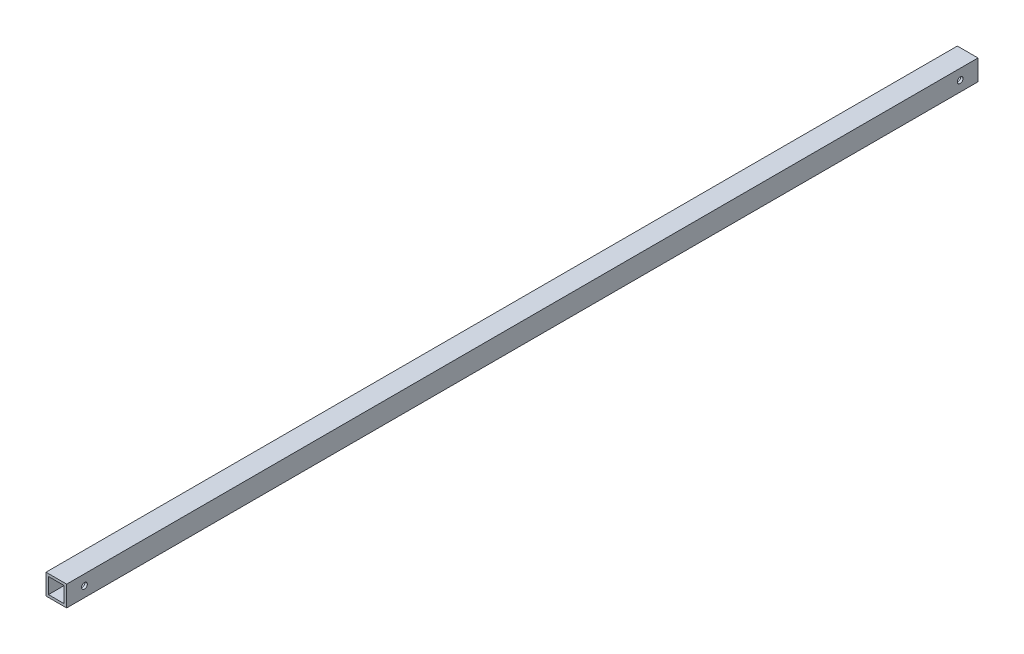
ISO-10303-21;
HEADER;
FILE_DESCRIPTION(('STEP AP214'),'2;1');
FILE_NAME('part.step','',(''),(''),'','','');
FILE_SCHEMA(('AUTOMOTIVE_DESIGN { 1 0 10303 214 1 1 1 1 }'));
ENDSEC;
DATA;
#1=APPLICATION_CONTEXT('core data for automotive mechanical design processes');
#2=APPLICATION_PROTOCOL_DEFINITION('international standard','automotive_design',2000,#1);
#3=PRODUCT_CONTEXT('',#1,'mechanical');
#4=PRODUCT('Part','Part','',(#3));
#5=PRODUCT_RELATED_PRODUCT_CATEGORY('part','',(#4));
#6=PRODUCT_DEFINITION_FORMATION('','',#4);
#7=PRODUCT_DEFINITION_CONTEXT('part definition',#1,'design');
#8=PRODUCT_DEFINITION('design','',#6,#7);
#9=PRODUCT_DEFINITION_SHAPE('','',#8);
#10=(LENGTH_UNIT() NAMED_UNIT(*) SI_UNIT(.MILLI.,.METRE.));
#11=(NAMED_UNIT(*) PLANE_ANGLE_UNIT() SI_UNIT($,.RADIAN.));
#12=(NAMED_UNIT(*) SI_UNIT($,.STERADIAN.) SOLID_ANGLE_UNIT());
#13=UNCERTAINTY_MEASURE_WITH_UNIT(LENGTH_MEASURE(1.E-05),#10,'distance_accuracy_value','');
#14=(GEOMETRIC_REPRESENTATION_CONTEXT(3) GLOBAL_UNCERTAINTY_ASSIGNED_CONTEXT((#13)) GLOBAL_UNIT_ASSIGNED_CONTEXT((#10,
#11,#12)) REPRESENTATION_CONTEXT('',''));
#15=CARTESIAN_POINT('',(0.,0.,0.));
#16=DIRECTION('',(0.,0.,1.));
#17=DIRECTION('',(1.,0.,0.));
#18=AXIS2_PLACEMENT_3D('',#15,#16,#17);
#19=CARTESIAN_POINT('',(0.,-25.,1102.75));
#20=DIRECTION('',(0.,0.,1.));
#21=DIRECTION('',(1.,0.,0.));
#22=AXIS2_PLACEMENT_3D('',#19,#20,#21);
#23=PLANE('',#22);
#24=DIRECTION('',(0.,-1.,0.));
#25=VECTOR('',#24,1.);
#26=CARTESIAN_POINT('',(0.,0.,1102.75));
#27=LINE('',#26,#25);
#28=CARTESIAN_POINT('',(0.,0.,1102.75));
#29=VERTEX_POINT('',#28);
#30=CARTESIAN_POINT('',(0.,-25.,1102.75));
#31=VERTEX_POINT('',#30);
#32=EDGE_CURVE('E139',#29,#31,#27,.T.);
#33=ORIENTED_EDGE('',*,*,#32,.T.);
#34=DIRECTION('',(1.,0.,0.));
#35=VECTOR('',#34,1.);
#36=CARTESIAN_POINT('',(0.,-25.,1102.75));
#37=LINE('',#36,#35);
#38=CARTESIAN_POINT('',(25.,-25.,1102.75));
#39=VERTEX_POINT('',#38);
#40=EDGE_CURVE('E142',#31,#39,#37,.T.);
#41=ORIENTED_EDGE('',*,*,#40,.T.);
#42=DIRECTION('',(0.,1.,0.));
#43=VECTOR('',#42,1.);
#44=CARTESIAN_POINT('',(25.,0.,1102.75));
#45=LINE('',#44,#43);
#46=CARTESIAN_POINT('',(25.,0.,1102.75));
#47=VERTEX_POINT('',#46);
#48=EDGE_CURVE('E145',#39,#47,#45,.T.);
#49=ORIENTED_EDGE('',*,*,#48,.T.);
#50=DIRECTION('',(-1.,0.,0.));
#51=VECTOR('',#50,1.);
#52=CARTESIAN_POINT('',(0.,0.,1102.75));
#53=LINE('',#52,#51);
#54=EDGE_CURVE('E147',#47,#29,#53,.T.);
#55=ORIENTED_EDGE('',*,*,#54,.T.);
#56=EDGE_LOOP('',(#33,#41,#49,#55));
#57=FACE_BOUND('',#56,.T.);
#58=DIRECTION('',(1.,0.,0.));
#59=VECTOR('',#58,1.);
#60=CARTESIAN_POINT('',(3.,-22.,1102.75));
#61=LINE('',#60,#59);
#62=CARTESIAN_POINT('',(3.,-22.,1102.75));
#63=VERTEX_POINT('',#62);
#64=CARTESIAN_POINT('',(22.,-22.,1102.75));
#65=VERTEX_POINT('',#64);
#66=EDGE_CURVE('E109',#63,#65,#61,.T.);
#67=ORIENTED_EDGE('',*,*,#66,.F.);
#68=DIRECTION('',(0.,-1.,0.));
#69=VECTOR('',#68,1.);
#70=CARTESIAN_POINT('',(3.,-3.,1102.75));
#71=LINE('',#70,#69);
#72=CARTESIAN_POINT('',(3.,-3.,1102.75));
#73=VERTEX_POINT('',#72);
#74=EDGE_CURVE('E101',#73,#63,#71,.T.);
#75=ORIENTED_EDGE('',*,*,#74,.F.);
#76=DIRECTION('',(-1.,0.,0.));
#77=VECTOR('',#76,1.);
#78=CARTESIAN_POINT('',(3.,-3.,1102.75));
#79=LINE('',#78,#77);
#80=CARTESIAN_POINT('',(22.,-3.,1102.75));
#81=VERTEX_POINT('',#80);
#82=EDGE_CURVE('E123',#81,#73,#79,.T.);
#83=ORIENTED_EDGE('',*,*,#82,.F.);
#84=DIRECTION('',(0.,1.,0.));
#85=VECTOR('',#84,1.);
#86=CARTESIAN_POINT('',(22.,-3.,1102.75));
#87=LINE('',#86,#85);
#88=EDGE_CURVE('E121',#65,#81,#87,.T.);
#89=ORIENTED_EDGE('',*,*,#88,.F.);
#90=EDGE_LOOP('',(#67,#75,#83,#89));
#91=FACE_BOUND('',#90,.T.);
#92=ADVANCED_FACE('F35',(#57,#91),#23,.T.);
#93=CARTESIAN_POINT('',(0.,-25.,0.));
#94=DIRECTION('',(0.,0.,1.));
#95=DIRECTION('',(1.,0.,0.));
#96=AXIS2_PLACEMENT_3D('',#93,#94,#95);
#97=PLANE('',#96);
#98=DIRECTION('',(0.,-1.,0.));
#99=VECTOR('',#98,1.);
#100=CARTESIAN_POINT('',(0.,0.,0.));
#101=LINE('',#100,#99);
#102=CARTESIAN_POINT('',(0.,0.,0.));
#103=VERTEX_POINT('',#102);
#104=CARTESIAN_POINT('',(0.,-25.,0.));
#105=VERTEX_POINT('',#104);
#106=EDGE_CURVE('E117',#103,#105,#101,.T.);
#107=ORIENTED_EDGE('',*,*,#106,.F.);
#108=DIRECTION('',(-1.,0.,0.));
#109=VECTOR('',#108,1.);
#110=CARTESIAN_POINT('',(0.,0.,0.));
#111=LINE('',#110,#109);
#112=CARTESIAN_POINT('',(25.,0.,0.));
#113=VERTEX_POINT('',#112);
#114=EDGE_CURVE('E143',#113,#103,#111,.T.);
#115=ORIENTED_EDGE('',*,*,#114,.F.);
#116=DIRECTION('',(0.,1.,0.));
#117=VECTOR('',#116,1.);
#118=CARTESIAN_POINT('',(25.,0.,0.));
#119=LINE('',#118,#117);
#120=CARTESIAN_POINT('',(25.,-25.,0.));
#121=VERTEX_POINT('',#120);
#122=EDGE_CURVE('E154',#121,#113,#119,.T.);
#123=ORIENTED_EDGE('',*,*,#122,.F.);
#124=DIRECTION('',(1.,0.,0.));
#125=VECTOR('',#124,1.);
#126=CARTESIAN_POINT('',(0.,-25.,0.));
#127=LINE('',#126,#125);
#128=EDGE_CURVE('E152',#105,#121,#127,.T.);
#129=ORIENTED_EDGE('',*,*,#128,.F.);
#130=EDGE_LOOP('',(#107,#115,#123,#129));
#131=FACE_BOUND('',#130,.T.);
#132=DIRECTION('',(0.,-1.,0.));
#133=VECTOR('',#132,1.);
#134=CARTESIAN_POINT('',(3.,-3.,0.));
#135=LINE('',#134,#133);
#136=CARTESIAN_POINT('',(3.,-3.,0.));
#137=VERTEX_POINT('',#136);
#138=CARTESIAN_POINT('',(3.,-22.,0.));
#139=VERTEX_POINT('',#138);
#140=EDGE_CURVE('E59',#137,#139,#135,.T.);
#141=ORIENTED_EDGE('',*,*,#140,.T.);
#142=DIRECTION('',(1.,0.,0.));
#143=VECTOR('',#142,1.);
#144=CARTESIAN_POINT('',(3.,-22.,0.));
#145=LINE('',#144,#143);
#146=CARTESIAN_POINT('',(22.,-22.,0.));
#147=VERTEX_POINT('',#146);
#148=EDGE_CURVE('E116',#139,#147,#145,.T.);
#149=ORIENTED_EDGE('',*,*,#148,.T.);
#150=DIRECTION('',(0.,1.,0.));
#151=VECTOR('',#150,1.);
#152=CARTESIAN_POINT('',(22.,-3.,0.));
#153=LINE('',#152,#151);
#154=CARTESIAN_POINT('',(22.,-3.,0.));
#155=VERTEX_POINT('',#154);
#156=EDGE_CURVE('E131',#147,#155,#153,.T.);
#157=ORIENTED_EDGE('',*,*,#156,.T.);
#158=DIRECTION('',(-1.,0.,0.));
#159=VECTOR('',#158,1.);
#160=CARTESIAN_POINT('',(3.,-3.,0.));
#161=LINE('',#160,#159);
#162=EDGE_CURVE('E110',#155,#137,#161,.T.);
#163=ORIENTED_EDGE('',*,*,#162,.T.);
#164=EDGE_LOOP('',(#141,#149,#157,#163));
#165=FACE_BOUND('',#164,.T.);
#166=ADVANCED_FACE('F173',(#131,#165),#97,.F.);
#167=CARTESIAN_POINT('',(0.,0.,1102.75));
#168=DIRECTION('',(1.,0.,0.));
#169=DIRECTION('',(0.,1.,0.));
#170=AXIS2_PLACEMENT_3D('',#167,#168,#169);
#171=PLANE('',#170);
#172=CARTESIAN_POINT('',(0.,-12.5,21.5599999999998));
#173=DIRECTION('',(-1.,0.,0.));
#174=DIRECTION('',(0.,0.,1.));
#175=AXIS2_PLACEMENT_3D('',#172,#173,#174);
#176=CIRCLE('',#175,3.5);
#177=CARTESIAN_POINT('',(0.,-12.5,25.0599999999998));
#178=VERTEX_POINT('',#177);
#179=EDGE_CURVE('E225',#178,#178,#176,.T.);
#180=ORIENTED_EDGE('',*,*,#179,.F.);
#181=EDGE_LOOP('',(#180));
#182=FACE_BOUND('',#181,.T.);
#183=CARTESIAN_POINT('',(0.,-12.5,1081.25));
#184=DIRECTION('',(-1.,0.,0.));
#185=DIRECTION('',(0.,0.,1.));
#186=AXIS2_PLACEMENT_3D('',#183,#184,#185);
#187=CIRCLE('',#186,3.5);
#188=CARTESIAN_POINT('',(0.,-12.5,1084.75));
#189=VERTEX_POINT('',#188);
#190=EDGE_CURVE('E221',#189,#189,#187,.T.);
#191=ORIENTED_EDGE('',*,*,#190,.F.);
#192=EDGE_LOOP('',(#191));
#193=FACE_BOUND('',#192,.T.);
#194=ORIENTED_EDGE('',*,*,#106,.T.);
#195=DIRECTION('',(0.,0.,-1.));
#196=VECTOR('',#195,1.);
#197=CARTESIAN_POINT('',(0.,-25.,1102.75));
#198=LINE('',#197,#196);
#199=EDGE_CURVE('E11',#31,#105,#198,.T.);
#200=ORIENTED_EDGE('',*,*,#199,.F.);
#201=ORIENTED_EDGE('',*,*,#32,.F.);
#202=DIRECTION('',(0.,0.,-1.));
#203=VECTOR('',#202,1.);
#204=CARTESIAN_POINT('',(0.,0.,1102.75));
#205=LINE('',#204,#203);
#206=EDGE_CURVE('E149',#29,#103,#205,.T.);
#207=ORIENTED_EDGE('',*,*,#206,.T.);
#208=EDGE_LOOP('',(#194,#200,#201,#207));
#209=FACE_BOUND('',#208,.T.);
#210=ADVANCED_FACE('F37',(#182,#193,#209),#171,.F.);
#211=CARTESIAN_POINT('',(0.,-25.,1102.75));
#212=DIRECTION('',(0.,1.,0.));
#213=DIRECTION('',(0.,0.,1.));
#214=AXIS2_PLACEMENT_3D('',#211,#212,#213);
#215=PLANE('',#214);
#216=ORIENTED_EDGE('',*,*,#128,.T.);
#217=DIRECTION('',(0.,0.,-1.));
#218=VECTOR('',#217,1.);
#219=CARTESIAN_POINT('',(25.,-25.,1102.75));
#220=LINE('',#219,#218);
#221=EDGE_CURVE('E44',#39,#121,#220,.T.);
#222=ORIENTED_EDGE('',*,*,#221,.F.);
#223=ORIENTED_EDGE('',*,*,#40,.F.);
#224=ORIENTED_EDGE('',*,*,#199,.T.);
#225=EDGE_LOOP('',(#216,#222,#223,#224));
#226=FACE_BOUND('',#225,.T.);
#227=ADVANCED_FACE('F183',(#226),#215,.F.);
#228=CARTESIAN_POINT('',(25.,0.,1102.75));
#229=DIRECTION('',(-1.,0.,0.));
#230=DIRECTION('',(0.,-1.,0.));
#231=AXIS2_PLACEMENT_3D('',#228,#229,#230);
#232=PLANE('',#231);
#233=CARTESIAN_POINT('',(25.,-12.5,21.5599999999998));
#234=DIRECTION('',(-1.,0.,0.));
#235=DIRECTION('',(0.,-1.,0.));
#236=AXIS2_PLACEMENT_3D('',#233,#234,#235);
#237=CIRCLE('',#236,3.49999999999999);
#238=CARTESIAN_POINT('',(25.,-16.,21.5599999999998));
#239=VERTEX_POINT('',#238);
#240=EDGE_CURVE('E229',#239,#239,#237,.T.);
#241=ORIENTED_EDGE('',*,*,#240,.T.);
#242=EDGE_LOOP('',(#241));
#243=FACE_BOUND('',#242,.T.);
#244=CARTESIAN_POINT('',(25.,-12.5,1081.25));
#245=DIRECTION('',(-1.,0.,0.));
#246=DIRECTION('',(0.,-1.,0.));
#247=AXIS2_PLACEMENT_3D('',#244,#245,#246);
#248=CIRCLE('',#247,3.49999999999999);
#249=CARTESIAN_POINT('',(25.,-16.,1081.25));
#250=VERTEX_POINT('',#249);
#251=EDGE_CURVE('E129',#250,#250,#248,.T.);
#252=ORIENTED_EDGE('',*,*,#251,.T.);
#253=EDGE_LOOP('',(#252));
#254=FACE_BOUND('',#253,.T.);
#255=ORIENTED_EDGE('',*,*,#122,.T.);
#256=DIRECTION('',(0.,0.,-1.));
#257=VECTOR('',#256,1.);
#258=CARTESIAN_POINT('',(25.,0.,1102.75));
#259=LINE('',#258,#257);
#260=EDGE_CURVE('E159',#47,#113,#259,.T.);
#261=ORIENTED_EDGE('',*,*,#260,.F.);
#262=ORIENTED_EDGE('',*,*,#48,.F.);
#263=ORIENTED_EDGE('',*,*,#221,.T.);
#264=EDGE_LOOP('',(#255,#261,#262,#263));
#265=FACE_BOUND('',#264,.T.);
#266=ADVANCED_FACE('F167',(#243,#254,#265),#232,.F.);
#267=CARTESIAN_POINT('',(0.,0.,1102.75));
#268=DIRECTION('',(0.,-1.,0.));
#269=DIRECTION('',(0.,0.,-1.));
#270=AXIS2_PLACEMENT_3D('',#267,#268,#269);
#271=PLANE('',#270);
#272=ORIENTED_EDGE('',*,*,#114,.T.);
#273=ORIENTED_EDGE('',*,*,#206,.F.);
#274=ORIENTED_EDGE('',*,*,#54,.F.);
#275=ORIENTED_EDGE('',*,*,#260,.T.);
#276=EDGE_LOOP('',(#272,#273,#274,#275));
#277=FACE_BOUND('',#276,.T.);
#278=ADVANCED_FACE('F177',(#277),#271,.F.);
#279=CARTESIAN_POINT('',(3.,-3.,1102.75));
#280=DIRECTION('',(1.,0.,0.));
#281=DIRECTION('',(0.,1.,0.));
#282=AXIS2_PLACEMENT_3D('',#279,#280,#281);
#283=PLANE('',#282);
#284=CARTESIAN_POINT('',(3.,-12.5,21.5599999999998));
#285=DIRECTION('',(1.,0.,0.));
#286=DIRECTION('',(0.,1.,0.));
#287=AXIS2_PLACEMENT_3D('',#284,#285,#286);
#288=CIRCLE('',#287,3.49999999999999);
#289=CARTESIAN_POINT('',(3.,-9.00000000000001,21.5599999999998));
#290=VERTEX_POINT('',#289);
#291=EDGE_CURVE('E213',#290,#290,#288,.T.);
#292=ORIENTED_EDGE('',*,*,#291,.F.);
#293=EDGE_LOOP('',(#292));
#294=FACE_BOUND('',#293,.T.);
#295=CARTESIAN_POINT('',(3.,-12.5,1081.25));
#296=DIRECTION('',(1.,0.,0.));
#297=DIRECTION('',(0.,1.,0.));
#298=AXIS2_PLACEMENT_3D('',#295,#296,#297);
#299=CIRCLE('',#298,3.49999999999999);
#300=CARTESIAN_POINT('',(3.,-9.00000000000001,1081.25));
#301=VERTEX_POINT('',#300);
#302=EDGE_CURVE('E216',#301,#301,#299,.T.);
#303=ORIENTED_EDGE('',*,*,#302,.F.);
#304=EDGE_LOOP('',(#303));
#305=FACE_BOUND('',#304,.T.);
#306=ORIENTED_EDGE('',*,*,#140,.F.);
#307=DIRECTION('',(0.,0.,-1.));
#308=VECTOR('',#307,1.);
#309=CARTESIAN_POINT('',(3.,-3.,1102.75));
#310=LINE('',#309,#308);
#311=EDGE_CURVE('E105',#73,#137,#310,.T.);
#312=ORIENTED_EDGE('',*,*,#311,.F.);
#313=ORIENTED_EDGE('',*,*,#74,.T.);
#314=DIRECTION('',(0.,0.,-1.));
#315=VECTOR('',#314,1.);
#316=CARTESIAN_POINT('',(3.,-22.,1102.75));
#317=LINE('',#316,#315);
#318=EDGE_CURVE('E104',#63,#139,#317,.T.);
#319=ORIENTED_EDGE('',*,*,#318,.T.);
#320=EDGE_LOOP('',(#306,#312,#313,#319));
#321=FACE_BOUND('',#320,.T.);
#322=ADVANCED_FACE('F103',(#294,#305,#321),#283,.T.);
#323=CARTESIAN_POINT('',(3.,-22.,1102.75));
#324=DIRECTION('',(0.,1.,0.));
#325=DIRECTION('',(0.,0.,1.));
#326=AXIS2_PLACEMENT_3D('',#323,#324,#325);
#327=PLANE('',#326);
#328=ORIENTED_EDGE('',*,*,#148,.F.);
#329=ORIENTED_EDGE('',*,*,#318,.F.);
#330=ORIENTED_EDGE('',*,*,#66,.T.);
#331=DIRECTION('',(0.,0.,-1.));
#332=VECTOR('',#331,1.);
#333=CARTESIAN_POINT('',(22.,-22.,1102.75));
#334=LINE('',#333,#332);
#335=EDGE_CURVE('E118',#65,#147,#334,.T.);
#336=ORIENTED_EDGE('',*,*,#335,.T.);
#337=EDGE_LOOP('',(#328,#329,#330,#336));
#338=FACE_BOUND('',#337,.T.);
#339=ADVANCED_FACE('F113',(#338),#327,.T.);
#340=CARTESIAN_POINT('',(22.,-3.,1102.75));
#341=DIRECTION('',(-1.,0.,0.));
#342=DIRECTION('',(0.,-1.,0.));
#343=AXIS2_PLACEMENT_3D('',#340,#341,#342);
#344=PLANE('',#343);
#345=CARTESIAN_POINT('',(22.,-12.5,21.5599999999998));
#346=DIRECTION('',(-1.,0.,0.));
#347=DIRECTION('',(0.,-1.,0.));
#348=AXIS2_PLACEMENT_3D('',#345,#346,#347);
#349=CIRCLE('',#348,3.49999999999999);
#350=CARTESIAN_POINT('',(22.,-16.,21.5599999999998));
#351=VERTEX_POINT('',#350);
#352=EDGE_CURVE('E232',#351,#351,#349,.T.);
#353=ORIENTED_EDGE('',*,*,#352,.F.);
#354=EDGE_LOOP('',(#353));
#355=FACE_BOUND('',#354,.T.);
#356=CARTESIAN_POINT('',(22.,-12.5,1081.25));
#357=DIRECTION('',(-1.,0.,0.));
#358=DIRECTION('',(0.,-1.,0.));
#359=AXIS2_PLACEMENT_3D('',#356,#357,#358);
#360=CIRCLE('',#359,3.49999999999999);
#361=CARTESIAN_POINT('',(22.,-16.,1081.25));
#362=VERTEX_POINT('',#361);
#363=EDGE_CURVE('E39',#362,#362,#360,.T.);
#364=ORIENTED_EDGE('',*,*,#363,.F.);
#365=EDGE_LOOP('',(#364));
#366=FACE_BOUND('',#365,.T.);
#367=ORIENTED_EDGE('',*,*,#156,.F.);
#368=ORIENTED_EDGE('',*,*,#335,.F.);
#369=ORIENTED_EDGE('',*,*,#88,.T.);
#370=DIRECTION('',(0.,0.,-1.));
#371=VECTOR('',#370,1.);
#372=CARTESIAN_POINT('',(22.,-3.,1102.75));
#373=LINE('',#372,#371);
#374=EDGE_CURVE('E51',#81,#155,#373,.T.);
#375=ORIENTED_EDGE('',*,*,#374,.T.);
#376=EDGE_LOOP('',(#367,#368,#369,#375));
#377=FACE_BOUND('',#376,.T.);
#378=ADVANCED_FACE('F209',(#355,#366,#377),#344,.T.);
#379=CARTESIAN_POINT('',(3.,-3.,1102.75));
#380=DIRECTION('',(0.,-1.,0.));
#381=DIRECTION('',(0.,0.,-1.));
#382=AXIS2_PLACEMENT_3D('',#379,#380,#381);
#383=PLANE('',#382);
#384=ORIENTED_EDGE('',*,*,#162,.F.);
#385=ORIENTED_EDGE('',*,*,#374,.F.);
#386=ORIENTED_EDGE('',*,*,#82,.T.);
#387=ORIENTED_EDGE('',*,*,#311,.T.);
#388=EDGE_LOOP('',(#384,#385,#386,#387));
#389=FACE_BOUND('',#388,.T.);
#390=ADVANCED_FACE('F241',(#389),#383,.T.);
#391=CARTESIAN_POINT('',(0.,-12.5,1081.25));
#392=DIRECTION('',(-1.,0.,0.));
#393=DIRECTION('',(0.,0.,1.));
#394=AXIS2_PLACEMENT_3D('',#391,#392,#393);
#395=CYLINDRICAL_SURFACE('',#394,3.49999999999999);
#396=ORIENTED_EDGE('',*,*,#363,.T.);
#397=EDGE_LOOP('',(#396));
#398=FACE_BOUND('',#397,.T.);
#399=ORIENTED_EDGE('',*,*,#251,.F.);
#400=EDGE_LOOP('',(#399));
#401=FACE_BOUND('',#400,.T.);
#402=ADVANCED_FACE('F247',(#398,#401),#395,.F.);
#403=ORIENTED_EDGE('',*,*,#302,.T.);
#404=EDGE_LOOP('',(#403));
#405=FACE_BOUND('',#404,.T.);
#406=ORIENTED_EDGE('',*,*,#190,.T.);
#407=EDGE_LOOP('',(#406));
#408=FACE_BOUND('',#407,.T.);
#409=ADVANCED_FACE('F252',(#405,#408),#395,.F.);
#410=CARTESIAN_POINT('',(0.,-12.5,21.5599999999998));
#411=DIRECTION('',(-1.,0.,0.));
#412=DIRECTION('',(0.,0.,1.));
#413=AXIS2_PLACEMENT_3D('',#410,#411,#412);
#414=CYLINDRICAL_SURFACE('',#413,3.49999999999999);
#415=ORIENTED_EDGE('',*,*,#291,.T.);
#416=EDGE_LOOP('',(#415));
#417=FACE_BOUND('',#416,.T.);
#418=ORIENTED_EDGE('',*,*,#179,.T.);
#419=EDGE_LOOP('',(#418));
#420=FACE_BOUND('',#419,.T.);
#421=ADVANCED_FACE('F256',(#417,#420),#414,.F.);
#422=CARTESIAN_POINT('',(0.,-12.5,21.5599999999998));
#423=DIRECTION('',(-1.,0.,0.));
#424=DIRECTION('',(0.,0.,1.));
#425=AXIS2_PLACEMENT_3D('',#422,#423,#424);
#426=CYLINDRICAL_SURFACE('',#425,3.49999999999999);
#427=ORIENTED_EDGE('',*,*,#352,.T.);
#428=EDGE_LOOP('',(#427));
#429=FACE_BOUND('',#428,.T.);
#430=ORIENTED_EDGE('',*,*,#240,.F.);
#431=EDGE_LOOP('',(#430));
#432=FACE_BOUND('',#431,.T.);
#433=ADVANCED_FACE('F236',(#429,#432),#426,.F.);
#434=CLOSED_SHELL('',(#92,#166,#210,#227,#266,#278,#322,#339,#378,#390,#402,#409,#421,#433));
#435=MANIFOLD_SOLID_BREP('B2',#434);
#436=ADVANCED_BREP_SHAPE_REPRESENTATION('',(#18,#435),#14);
#437=SHAPE_DEFINITION_REPRESENTATION(#9,#436);
ENDSEC;
END-ISO-10303-21;
